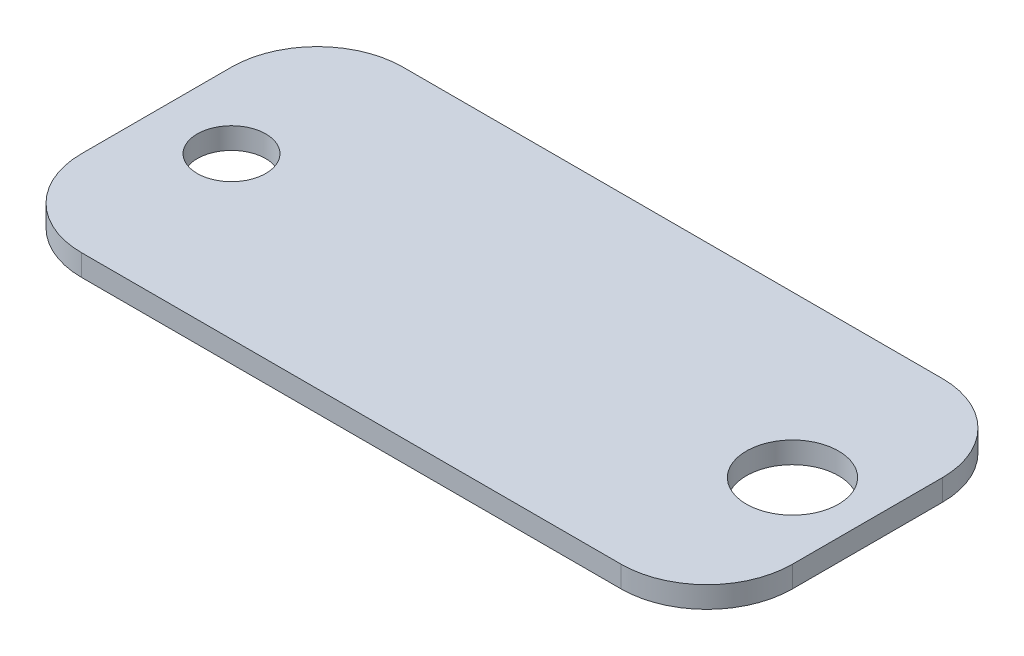
ISO-10303-21;
HEADER;
FILE_DESCRIPTION(('STEP AP214'),'2;1');
FILE_NAME('part.step','',(''),(''),'','','');
FILE_SCHEMA(('AUTOMOTIVE_DESIGN { 1 0 10303 214 1 1 1 1 }'));
ENDSEC;
DATA;
#1=APPLICATION_CONTEXT('core data for automotive mechanical design processes');
#2=APPLICATION_PROTOCOL_DEFINITION('international standard','automotive_design',2000,#1);
#3=PRODUCT_CONTEXT('',#1,'mechanical');
#4=PRODUCT('Part','Part','',(#3));
#5=PRODUCT_RELATED_PRODUCT_CATEGORY('part','',(#4));
#6=PRODUCT_DEFINITION_FORMATION('','',#4);
#7=PRODUCT_DEFINITION_CONTEXT('part definition',#1,'design');
#8=PRODUCT_DEFINITION('design','',#6,#7);
#9=PRODUCT_DEFINITION_SHAPE('','',#8);
#10=(LENGTH_UNIT() NAMED_UNIT(*) SI_UNIT(.MILLI.,.METRE.));
#11=(NAMED_UNIT(*) PLANE_ANGLE_UNIT() SI_UNIT($,.RADIAN.));
#12=(NAMED_UNIT(*) SI_UNIT($,.STERADIAN.) SOLID_ANGLE_UNIT());
#13=UNCERTAINTY_MEASURE_WITH_UNIT(LENGTH_MEASURE(1.E-05),#10,'distance_accuracy_value','');
#14=(GEOMETRIC_REPRESENTATION_CONTEXT(3) GLOBAL_UNCERTAINTY_ASSIGNED_CONTEXT((#13)) GLOBAL_UNIT_ASSIGNED_CONTEXT((#10,
#11,#12)) REPRESENTATION_CONTEXT('',''));
#15=CARTESIAN_POINT('',(0.,0.,0.));
#16=DIRECTION('',(0.,0.,1.));
#17=DIRECTION('',(1.,0.,0.));
#18=AXIS2_PLACEMENT_3D('',#15,#16,#17);
#19=CARTESIAN_POINT('',(-210.8,6.14303097578365,188.621825406948));
#20=DIRECTION('',(-1.,0.,0.));
#21=DIRECTION('',(0.,0.,1.));
#22=AXIS2_PLACEMENT_3D('',#19,#20,#21);
#23=PLANE('',#22);
#24=DIRECTION('',(0.,0.,1.));
#25=VECTOR('',#24,1.);
#26=CARTESIAN_POINT('',(-210.8,7.14303097578365,188.621825406948));
#27=LINE('',#26,#25);
#28=CARTESIAN_POINT('',(-210.8,7.14303097578365,177.621825406948));
#29=VERTEX_POINT('',#28);
#30=CARTESIAN_POINT('',(-210.8,7.14303097578365,184.621825406948));
#31=VERTEX_POINT('',#30);
#32=EDGE_CURVE('E109',#29,#31,#27,.T.);
#33=ORIENTED_EDGE('',*,*,#32,.F.);
#34=DIRECTION('',(0.,1.,0.));
#35=VECTOR('',#34,1.);
#36=CARTESIAN_POINT('',(-210.8,6.14303097578365,177.621825406948));
#37=LINE('',#36,#35);
#38=CARTESIAN_POINT('',(-210.8,6.14303097578365,177.621825406948));
#39=VERTEX_POINT('',#38);
#40=EDGE_CURVE('E11',#29,#39,#37,.F.);
#41=ORIENTED_EDGE('',*,*,#40,.T.);
#42=DIRECTION('',(0.,0.,1.));
#43=VECTOR('',#42,1.);
#44=CARTESIAN_POINT('',(-210.8,6.14303097578365,188.621825406948));
#45=LINE('',#44,#43);
#46=CARTESIAN_POINT('',(-210.8,6.14303097578365,184.621825406948));
#47=VERTEX_POINT('',#46);
#48=EDGE_CURVE('E159',#39,#47,#45,.T.);
#49=ORIENTED_EDGE('',*,*,#48,.T.);
#50=DIRECTION('',(0.,1.,0.));
#51=VECTOR('',#50,1.);
#52=CARTESIAN_POINT('',(-210.8,6.14303097578365,184.621825406948));
#53=LINE('',#52,#51);
#54=EDGE_CURVE('E46',#47,#31,#53,.T.);
#55=ORIENTED_EDGE('',*,*,#54,.T.);
#56=EDGE_LOOP('',(#33,#41,#49,#55));
#57=FACE_BOUND('',#56,.T.);
#58=ADVANCED_FACE('F38',(#57),#23,.T.);
#59=CARTESIAN_POINT('',(-177.621825406948,6.14303097578365,173.621825406948));
#60=DIRECTION('',(0.,0.,-1.));
#61=DIRECTION('',(-1.,0.,0.));
#62=AXIS2_PLACEMENT_3D('',#59,#60,#61);
#63=PLANE('',#62);
#64=DIRECTION('',(-1.,0.,0.));
#65=VECTOR('',#64,1.);
#66=CARTESIAN_POINT('',(-177.621825406948,7.14303097578365,173.621825406948));
#67=LINE('',#66,#65);
#68=CARTESIAN_POINT('',(-181.621825406948,7.14303097578365,173.621825406948));
#69=VERTEX_POINT('',#68);
#70=CARTESIAN_POINT('',(-206.8,7.14303097578365,173.621825406948));
#71=VERTEX_POINT('',#70);
#72=EDGE_CURVE('E134',#69,#71,#67,.T.);
#73=ORIENTED_EDGE('',*,*,#72,.F.);
#74=DIRECTION('',(0.,1.,0.));
#75=VECTOR('',#74,1.);
#76=CARTESIAN_POINT('',(-181.621825406948,6.14303097578365,173.621825406948));
#77=LINE('',#76,#75);
#78=CARTESIAN_POINT('',(-181.621825406948,6.14303097578365,173.621825406948));
#79=VERTEX_POINT('',#78);
#80=EDGE_CURVE('E60',#69,#79,#77,.F.);
#81=ORIENTED_EDGE('',*,*,#80,.T.);
#82=DIRECTION('',(-1.,0.,0.));
#83=VECTOR('',#82,1.);
#84=CARTESIAN_POINT('',(-177.621825406948,6.14303097578365,173.621825406948));
#85=LINE('',#84,#83);
#86=CARTESIAN_POINT('',(-206.8,6.14303097578365,173.621825406948));
#87=VERTEX_POINT('',#86);
#88=EDGE_CURVE('E128',#79,#87,#85,.T.);
#89=ORIENTED_EDGE('',*,*,#88,.T.);
#90=DIRECTION('',(0.,1.,0.));
#91=VECTOR('',#90,1.);
#92=CARTESIAN_POINT('',(-206.8,6.14303097578365,173.621825406948));
#93=LINE('',#92,#91);
#94=EDGE_CURVE('E153',#87,#71,#93,.T.);
#95=ORIENTED_EDGE('',*,*,#94,.T.);
#96=EDGE_LOOP('',(#73,#81,#89,#95));
#97=FACE_BOUND('',#96,.T.);
#98=ADVANCED_FACE('F196',(#97),#63,.T.);
#99=CARTESIAN_POINT('',(-177.621825406948,6.14303097578365,188.621825406948));
#100=DIRECTION('',(1.,0.,0.));
#101=DIRECTION('',(0.,0.,-1.));
#102=AXIS2_PLACEMENT_3D('',#99,#100,#101);
#103=PLANE('',#102);
#104=DIRECTION('',(0.,0.,-1.));
#105=VECTOR('',#104,1.);
#106=CARTESIAN_POINT('',(-177.621825406948,7.14303097578365,188.621825406948));
#107=LINE('',#106,#105);
#108=CARTESIAN_POINT('',(-177.621825406948,7.14303097578365,184.621825406948));
#109=VERTEX_POINT('',#108);
#110=CARTESIAN_POINT('',(-177.621825406948,7.14303097578365,177.621825406948));
#111=VERTEX_POINT('',#110);
#112=EDGE_CURVE('E124',#109,#111,#107,.T.);
#113=ORIENTED_EDGE('',*,*,#112,.F.);
#114=DIRECTION('',(0.,1.,0.));
#115=VECTOR('',#114,1.);
#116=CARTESIAN_POINT('',(-177.621825406948,6.14303097578365,184.621825406948));
#117=LINE('',#116,#115);
#118=CARTESIAN_POINT('',(-177.621825406948,6.14303097578365,184.621825406948));
#119=VERTEX_POINT('',#118);
#120=EDGE_CURVE('E145',#109,#119,#117,.F.);
#121=ORIENTED_EDGE('',*,*,#120,.T.);
#122=DIRECTION('',(0.,0.,-1.));
#123=VECTOR('',#122,1.);
#124=CARTESIAN_POINT('',(-177.621825406948,6.14303097578365,188.621825406948));
#125=LINE('',#124,#123);
#126=CARTESIAN_POINT('',(-177.621825406948,6.14303097578365,177.621825406948));
#127=VERTEX_POINT('',#126);
#128=EDGE_CURVE('E131',#119,#127,#125,.T.);
#129=ORIENTED_EDGE('',*,*,#128,.T.);
#130=DIRECTION('',(0.,1.,0.));
#131=VECTOR('',#130,1.);
#132=CARTESIAN_POINT('',(-177.621825406948,6.14303097578365,177.621825406948));
#133=LINE('',#132,#131);
#134=EDGE_CURVE('E142',#127,#111,#133,.T.);
#135=ORIENTED_EDGE('',*,*,#134,.T.);
#136=EDGE_LOOP('',(#113,#121,#129,#135));
#137=FACE_BOUND('',#136,.T.);
#138=ADVANCED_FACE('F174',(#137),#103,.T.);
#139=CARTESIAN_POINT('',(-177.621825406948,6.14303097578365,188.621825406948));
#140=DIRECTION('',(0.,0.,1.));
#141=DIRECTION('',(1.,0.,0.));
#142=AXIS2_PLACEMENT_3D('',#139,#140,#141);
#143=PLANE('',#142);
#144=DIRECTION('',(1.,0.,0.));
#145=VECTOR('',#144,1.);
#146=CARTESIAN_POINT('',(-177.621825406948,6.14303097578365,188.621825406948));
#147=LINE('',#146,#145);
#148=CARTESIAN_POINT('',(-206.8,6.14303097578365,188.621825406948));
#149=VERTEX_POINT('',#148);
#150=CARTESIAN_POINT('',(-181.621825406948,6.14303097578365,188.621825406948));
#151=VERTEX_POINT('',#150);
#152=EDGE_CURVE('E160',#149,#151,#147,.T.);
#153=ORIENTED_EDGE('',*,*,#152,.T.);
#154=DIRECTION('',(0.,1.,0.));
#155=VECTOR('',#154,1.);
#156=CARTESIAN_POINT('',(-181.621825406948,6.14303097578365,188.621825406948));
#157=LINE('',#156,#155);
#158=CARTESIAN_POINT('',(-181.621825406948,7.14303097578365,188.621825406948));
#159=VERTEX_POINT('',#158);
#160=EDGE_CURVE('E115',#151,#159,#157,.T.);
#161=ORIENTED_EDGE('',*,*,#160,.T.);
#162=DIRECTION('',(1.,0.,0.));
#163=VECTOR('',#162,1.);
#164=CARTESIAN_POINT('',(-177.621825406948,7.14303097578365,188.621825406948));
#165=LINE('',#164,#163);
#166=CARTESIAN_POINT('',(-206.8,7.14303097578365,188.621825406948));
#167=VERTEX_POINT('',#166);
#168=EDGE_CURVE('E107',#167,#159,#165,.T.);
#169=ORIENTED_EDGE('',*,*,#168,.F.);
#170=DIRECTION('',(0.,1.,0.));
#171=VECTOR('',#170,1.);
#172=CARTESIAN_POINT('',(-206.8,6.14303097578365,188.621825406948));
#173=LINE('',#172,#171);
#174=EDGE_CURVE('E121',#167,#149,#173,.F.);
#175=ORIENTED_EDGE('',*,*,#174,.T.);
#176=EDGE_LOOP('',(#153,#161,#169,#175));
#177=FACE_BOUND('',#176,.T.);
#178=ADVANCED_FACE('F120',(#177),#143,.T.);
#179=CARTESIAN_POINT('',(0.,6.14303097578365,0.));
#180=DIRECTION('',(0.,1.,0.));
#181=DIRECTION('',(0.,0.,1.));
#182=AXIS2_PLACEMENT_3D('',#179,#180,#181);
#183=PLANE('',#182);
#184=CARTESIAN_POINT('',(-181.121825406948,6.14303097578365,181.121825406948));
#185=DIRECTION('',(0.,1.,0.));
#186=DIRECTION('',(0.,0.,1.));
#187=AXIS2_PLACEMENT_3D('',#184,#185,#186);
#188=CIRCLE('',#187,2.15);
#189=CARTESIAN_POINT('',(-181.121825406948,6.14303097578365,183.271825406948));
#190=VERTEX_POINT('',#189);
#191=EDGE_CURVE('E226',#190,#190,#188,.T.);
#192=ORIENTED_EDGE('',*,*,#191,.T.);
#193=EDGE_LOOP('',(#192));
#194=FACE_BOUND('',#193,.T.);
#195=CARTESIAN_POINT('',(-207.3,6.14303097578365,181.121825406948));
#196=DIRECTION('',(0.,1.,0.));
#197=DIRECTION('',(0.,0.,1.));
#198=AXIS2_PLACEMENT_3D('',#195,#196,#197);
#199=CIRCLE('',#198,1.59999999999999);
#200=CARTESIAN_POINT('',(-207.3,6.14303097578365,182.721825406948));
#201=VERTEX_POINT('',#200);
#202=EDGE_CURVE('E165',#201,#201,#199,.T.);
#203=ORIENTED_EDGE('',*,*,#202,.T.);
#204=EDGE_LOOP('',(#203));
#205=FACE_BOUND('',#204,.T.);
#206=ORIENTED_EDGE('',*,*,#128,.F.);
#207=CARTESIAN_POINT('',(-181.621825406948,6.14303097578365,184.621825406948));
#208=DIRECTION('',(0.,1.,0.));
#209=DIRECTION('',(0.,0.,1.));
#210=AXIS2_PLACEMENT_3D('',#207,#208,#209);
#211=CIRCLE('',#210,4.);
#212=EDGE_CURVE('E151',#119,#151,#211,.F.);
#213=ORIENTED_EDGE('',*,*,#212,.T.);
#214=ORIENTED_EDGE('',*,*,#152,.F.);
#215=CARTESIAN_POINT('',(-206.8,6.14303097578365,184.621825406948));
#216=DIRECTION('',(0.,1.,0.));
#217=DIRECTION('',(0.,0.,1.));
#218=AXIS2_PLACEMENT_3D('',#215,#216,#217);
#219=CIRCLE('',#218,4.);
#220=EDGE_CURVE('E127',#149,#47,#219,.F.);
#221=ORIENTED_EDGE('',*,*,#220,.T.);
#222=ORIENTED_EDGE('',*,*,#48,.F.);
#223=CARTESIAN_POINT('',(-206.8,6.14303097578365,177.621825406948));
#224=DIRECTION('',(0.,1.,0.));
#225=DIRECTION('',(0.,0.,1.));
#226=AXIS2_PLACEMENT_3D('',#223,#224,#225);
#227=CIRCLE('',#226,4.);
#228=EDGE_CURVE('E53',#39,#87,#227,.F.);
#229=ORIENTED_EDGE('',*,*,#228,.T.);
#230=ORIENTED_EDGE('',*,*,#88,.F.);
#231=CARTESIAN_POINT('',(-181.621825406948,6.14303097578365,177.621825406948));
#232=DIRECTION('',(0.,1.,0.));
#233=DIRECTION('',(0.,0.,1.));
#234=AXIS2_PLACEMENT_3D('',#231,#232,#233);
#235=CIRCLE('',#234,4.);
#236=EDGE_CURVE('E149',#79,#127,#235,.F.);
#237=ORIENTED_EDGE('',*,*,#236,.T.);
#238=EDGE_LOOP('',(#206,#213,#214,#221,#222,#229,#230,#237));
#239=FACE_BOUND('',#238,.T.);
#240=ADVANCED_FACE('F180',(#194,#205,#239),#183,.F.);
#241=CARTESIAN_POINT('',(0.,7.14303097578365,0.));
#242=DIRECTION('',(0.,1.,0.));
#243=DIRECTION('',(0.,0.,1.));
#244=AXIS2_PLACEMENT_3D('',#241,#242,#243);
#245=PLANE('',#244);
#246=CARTESIAN_POINT('',(-181.121825406948,7.14303097578365,181.121825406948));
#247=DIRECTION('',(0.,1.,0.));
#248=DIRECTION('',(0.,0.,1.));
#249=AXIS2_PLACEMENT_3D('',#246,#247,#248);
#250=CIRCLE('',#249,2.15000000000001);
#251=CARTESIAN_POINT('',(-181.121825406948,7.14303097578365,183.271825406948));
#252=VERTEX_POINT('',#251);
#253=EDGE_CURVE('E229',#252,#252,#250,.T.);
#254=ORIENTED_EDGE('',*,*,#253,.F.);
#255=EDGE_LOOP('',(#254));
#256=FACE_BOUND('',#255,.T.);
#257=CARTESIAN_POINT('',(-207.3,7.14303097578365,181.121825406948));
#258=DIRECTION('',(0.,1.,0.));
#259=DIRECTION('',(0.,0.,1.));
#260=AXIS2_PLACEMENT_3D('',#257,#258,#259);
#261=CIRCLE('',#260,1.59999999999999);
#262=CARTESIAN_POINT('',(-207.3,7.14303097578365,182.721825406948));
#263=VERTEX_POINT('',#262);
#264=EDGE_CURVE('E231',#263,#263,#261,.T.);
#265=ORIENTED_EDGE('',*,*,#264,.F.);
#266=EDGE_LOOP('',(#265));
#267=FACE_BOUND('',#266,.T.);
#268=ORIENTED_EDGE('',*,*,#168,.T.);
#269=CARTESIAN_POINT('',(-181.621825406948,7.14303097578365,184.621825406948));
#270=DIRECTION('',(0.,1.,0.));
#271=DIRECTION('',(0.,0.,1.));
#272=AXIS2_PLACEMENT_3D('',#269,#270,#271);
#273=CIRCLE('',#272,4.);
#274=EDGE_CURVE('E140',#159,#109,#273,.T.);
#275=ORIENTED_EDGE('',*,*,#274,.T.);
#276=ORIENTED_EDGE('',*,*,#112,.T.);
#277=CARTESIAN_POINT('',(-181.621825406948,7.14303097578365,177.621825406948));
#278=DIRECTION('',(0.,1.,0.));
#279=DIRECTION('',(0.,0.,1.));
#280=AXIS2_PLACEMENT_3D('',#277,#278,#279);
#281=CIRCLE('',#280,4.);
#282=EDGE_CURVE('E138',#111,#69,#281,.T.);
#283=ORIENTED_EDGE('',*,*,#282,.T.);
#284=ORIENTED_EDGE('',*,*,#72,.T.);
#285=CARTESIAN_POINT('',(-206.8,7.14303097578365,177.621825406948));
#286=DIRECTION('',(0.,1.,0.));
#287=DIRECTION('',(0.,0.,1.));
#288=AXIS2_PLACEMENT_3D('',#285,#286,#287);
#289=CIRCLE('',#288,4.);
#290=EDGE_CURVE('E114',#71,#29,#289,.T.);
#291=ORIENTED_EDGE('',*,*,#290,.T.);
#292=ORIENTED_EDGE('',*,*,#32,.T.);
#293=CARTESIAN_POINT('',(-206.8,7.14303097578365,184.621825406948));
#294=DIRECTION('',(0.,1.,0.));
#295=DIRECTION('',(0.,0.,1.));
#296=AXIS2_PLACEMENT_3D('',#293,#294,#295);
#297=CIRCLE('',#296,4.);
#298=EDGE_CURVE('E104',#31,#167,#297,.T.);
#299=ORIENTED_EDGE('',*,*,#298,.T.);
#300=EDGE_LOOP('',(#268,#275,#276,#283,#284,#291,#292,#299));
#301=FACE_BOUND('',#300,.T.);
#302=ADVANCED_FACE('F106',(#256,#267,#301),#245,.T.);
#303=CARTESIAN_POINT('',(-207.3,7.14303097578365,181.121825406948));
#304=DIRECTION('',(0.,1.,0.));
#305=DIRECTION('',(0.,0.,1.));
#306=AXIS2_PLACEMENT_3D('',#303,#304,#305);
#307=CYLINDRICAL_SURFACE('',#306,1.59999999999999);
#308=ORIENTED_EDGE('',*,*,#202,.F.);
#309=EDGE_LOOP('',(#308));
#310=FACE_BOUND('',#309,.T.);
#311=ORIENTED_EDGE('',*,*,#264,.T.);
#312=EDGE_LOOP('',(#311));
#313=FACE_BOUND('',#312,.T.);
#314=ADVANCED_FACE('F210',(#310,#313),#307,.F.);
#315=CARTESIAN_POINT('',(-181.121825406948,7.14303097578365,181.121825406948));
#316=DIRECTION('',(0.,1.,0.));
#317=DIRECTION('',(0.,0.,1.));
#318=AXIS2_PLACEMENT_3D('',#315,#316,#317);
#319=CYLINDRICAL_SURFACE('',#318,2.15);
#320=ORIENTED_EDGE('',*,*,#191,.F.);
#321=EDGE_LOOP('',(#320));
#322=FACE_BOUND('',#321,.T.);
#323=ORIENTED_EDGE('',*,*,#253,.T.);
#324=EDGE_LOOP('',(#323));
#325=FACE_BOUND('',#324,.T.);
#326=ADVANCED_FACE('F193',(#322,#325),#319,.F.);
#327=CARTESIAN_POINT('',(-181.621825406948,6.14303097578365,184.621825406948));
#328=DIRECTION('',(0.,1.,0.));
#329=DIRECTION('',(0.,0.,1.));
#330=AXIS2_PLACEMENT_3D('',#327,#328,#329);
#331=CYLINDRICAL_SURFACE('',#330,4.);
#332=ORIENTED_EDGE('',*,*,#212,.F.);
#333=ORIENTED_EDGE('',*,*,#120,.F.);
#334=ORIENTED_EDGE('',*,*,#274,.F.);
#335=ORIENTED_EDGE('',*,*,#160,.F.);
#336=EDGE_LOOP('',(#332,#333,#334,#335));
#337=FACE_BOUND('',#336,.T.);
#338=ADVANCED_FACE('F179',(#337),#331,.T.);
#339=CARTESIAN_POINT('',(-181.621825406948,6.14303097578365,177.621825406948));
#340=DIRECTION('',(0.,1.,0.));
#341=DIRECTION('',(0.,0.,1.));
#342=AXIS2_PLACEMENT_3D('',#339,#340,#341);
#343=CYLINDRICAL_SURFACE('',#342,4.);
#344=ORIENTED_EDGE('',*,*,#236,.F.);
#345=ORIENTED_EDGE('',*,*,#80,.F.);
#346=ORIENTED_EDGE('',*,*,#282,.F.);
#347=ORIENTED_EDGE('',*,*,#134,.F.);
#348=EDGE_LOOP('',(#344,#345,#346,#347));
#349=FACE_BOUND('',#348,.T.);
#350=ADVANCED_FACE('F183',(#349),#343,.T.);
#351=CARTESIAN_POINT('',(-206.8,6.14303097578365,177.621825406948));
#352=DIRECTION('',(0.,1.,0.));
#353=DIRECTION('',(0.,0.,1.));
#354=AXIS2_PLACEMENT_3D('',#351,#352,#353);
#355=CYLINDRICAL_SURFACE('',#354,4.);
#356=ORIENTED_EDGE('',*,*,#228,.F.);
#357=ORIENTED_EDGE('',*,*,#40,.F.);
#358=ORIENTED_EDGE('',*,*,#290,.F.);
#359=ORIENTED_EDGE('',*,*,#94,.F.);
#360=EDGE_LOOP('',(#356,#357,#358,#359));
#361=FACE_BOUND('',#360,.T.);
#362=ADVANCED_FACE('F185',(#361),#355,.T.);
#363=CARTESIAN_POINT('',(-206.8,6.14303097578365,184.621825406948));
#364=DIRECTION('',(0.,1.,0.));
#365=DIRECTION('',(0.,0.,1.));
#366=AXIS2_PLACEMENT_3D('',#363,#364,#365);
#367=CYLINDRICAL_SURFACE('',#366,4.);
#368=ORIENTED_EDGE('',*,*,#220,.F.);
#369=ORIENTED_EDGE('',*,*,#174,.F.);
#370=ORIENTED_EDGE('',*,*,#298,.F.);
#371=ORIENTED_EDGE('',*,*,#54,.F.);
#372=EDGE_LOOP('',(#368,#369,#370,#371));
#373=FACE_BOUND('',#372,.T.);
#374=ADVANCED_FACE('F40',(#373),#367,.T.);
#375=CLOSED_SHELL('',(#58,#98,#138,#178,#240,#302,#314,#326,#338,#350,#362,#374));
#376=MANIFOLD_SOLID_BREP('B2',#375);
#377=ADVANCED_BREP_SHAPE_REPRESENTATION('',(#18,#376),#14);
#378=SHAPE_DEFINITION_REPRESENTATION(#9,#377);
ENDSEC;
END-ISO-10303-21;
